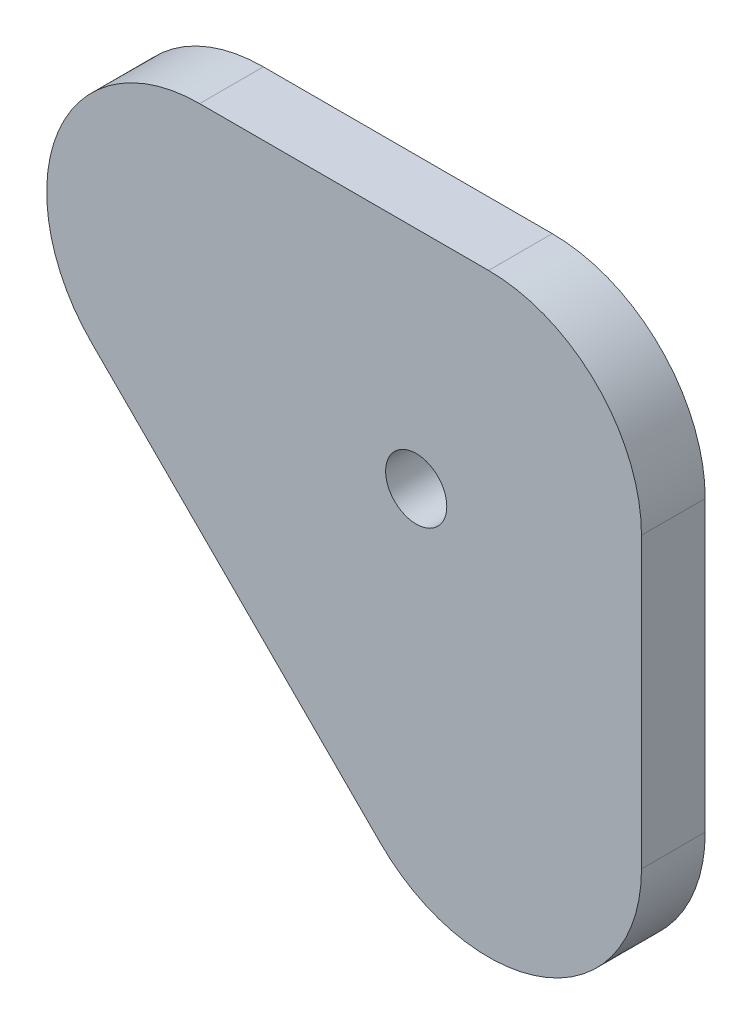
ISO-10303-21;
HEADER;
FILE_DESCRIPTION(('STEP AP214'),'2;1');
FILE_NAME('part.step','',(''),(''),'','','');
FILE_SCHEMA(('AUTOMOTIVE_DESIGN { 1 0 10303 214 1 1 1 1 }'));
ENDSEC;
DATA;
#1=APPLICATION_CONTEXT('core data for automotive mechanical design processes');
#2=APPLICATION_PROTOCOL_DEFINITION('international standard','automotive_design',2000,#1);
#3=PRODUCT_CONTEXT('',#1,'mechanical');
#4=PRODUCT('Part','Part','',(#3));
#5=PRODUCT_RELATED_PRODUCT_CATEGORY('part','',(#4));
#6=PRODUCT_DEFINITION_FORMATION('','',#4);
#7=PRODUCT_DEFINITION_CONTEXT('part definition',#1,'design');
#8=PRODUCT_DEFINITION('design','',#6,#7);
#9=PRODUCT_DEFINITION_SHAPE('','',#8);
#10=(LENGTH_UNIT() NAMED_UNIT(*) SI_UNIT(.MILLI.,.METRE.));
#11=(NAMED_UNIT(*) PLANE_ANGLE_UNIT() SI_UNIT($,.RADIAN.));
#12=(NAMED_UNIT(*) SI_UNIT($,.STERADIAN.) SOLID_ANGLE_UNIT());
#13=UNCERTAINTY_MEASURE_WITH_UNIT(LENGTH_MEASURE(1.E-05),#10,'distance_accuracy_value','');
#14=(GEOMETRIC_REPRESENTATION_CONTEXT(3) GLOBAL_UNCERTAINTY_ASSIGNED_CONTEXT((#13)) GLOBAL_UNIT_ASSIGNED_CONTEXT((#10,
#11,#12)) REPRESENTATION_CONTEXT('',''));
#15=CARTESIAN_POINT('',(0.,0.,0.));
#16=DIRECTION('',(0.,0.,1.));
#17=DIRECTION('',(1.,0.,0.));
#18=AXIS2_PLACEMENT_3D('',#15,#16,#17);
#19=CARTESIAN_POINT('',(-92.146105664654,-73.1582446553416,5.));
#20=DIRECTION('',(0.,0.,1.));
#21=DIRECTION('',(1.,0.,0.));
#22=AXIS2_PLACEMENT_3D('',#19,#20,#21);
#23=PLANE('',#22);
#24=CARTESIAN_POINT('',(-92.146105664654,-73.1582446553416,5.));
#25=DIRECTION('',(0.,0.,1.));
#26=DIRECTION('',(1.,0.,0.));
#27=AXIS2_PLACEMENT_3D('',#24,#25,#26);
#28=CIRCLE('',#27,11.9999999999999);
#29=CARTESIAN_POINT('',(-92.146105664654,-61.1582446553416,5.));
#30=VERTEX_POINT('',#29);
#31=CARTESIAN_POINT('',(-100.631387038892,-81.64352602958,5.));
#32=VERTEX_POINT('',#31);
#33=EDGE_CURVE('E128',#30,#32,#28,.T.);
#34=ORIENTED_EDGE('',*,*,#33,.T.);
#35=DIRECTION('',(0.707106781186534,-0.707106781186561,0.));
#36=VECTOR('',#35,1.);
#37=CARTESIAN_POINT('',(-100.631387038892,-81.64352602958,5.));
#38=LINE('',#37,#36);
#39=CARTESIAN_POINT('',(-77.9623394805927,-104.31257358788,5.));
#40=VERTEX_POINT('',#39);
#41=EDGE_CURVE('E86',#32,#40,#38,.T.);
#42=ORIENTED_EDGE('',*,*,#41,.T.);
#43=CARTESIAN_POINT('',(-69.477058106354,-95.8272922136416,5.));
#44=DIRECTION('',(0.,0.,1.));
#45=DIRECTION('',(1.,0.,0.));
#46=AXIS2_PLACEMENT_3D('',#43,#44,#45);
#47=CIRCLE('',#46,12.0000000000002);
#48=CARTESIAN_POINT('',(-57.477058106354,-95.8272922136416,5.));
#49=VERTEX_POINT('',#48);
#50=EDGE_CURVE('E99',#40,#49,#47,.T.);
#51=ORIENTED_EDGE('',*,*,#50,.T.);
#52=DIRECTION('',(0.,1.,0.));
#53=VECTOR('',#52,1.);
#54=CARTESIAN_POINT('',(-57.477058106354,-95.8272922136416,5.));
#55=LINE('',#54,#53);
#56=CARTESIAN_POINT('',(-57.4770581063536,-73.1582446553416,5.));
#57=VERTEX_POINT('',#56);
#58=EDGE_CURVE('E93',#49,#57,#55,.T.);
#59=ORIENTED_EDGE('',*,*,#58,.T.);
#60=CARTESIAN_POINT('',(-69.477058106354,-73.1582446553416,5.));
#61=DIRECTION('',(0.,0.,1.));
#62=DIRECTION('',(1.,0.,0.));
#63=AXIS2_PLACEMENT_3D('',#60,#61,#62);
#64=CIRCLE('',#63,12.0000000000003);
#65=CARTESIAN_POINT('',(-69.477058106354,-61.1582446553416,5.));
#66=VERTEX_POINT('',#65);
#67=EDGE_CURVE('E97',#57,#66,#64,.T.);
#68=ORIENTED_EDGE('',*,*,#67,.T.);
#69=DIRECTION('',(-1.,0.,0.));
#70=VECTOR('',#69,1.);
#71=CARTESIAN_POINT('',(-69.477058106354,-61.1582446553416,5.));
#72=LINE('',#71,#70);
#73=EDGE_CURVE('E49',#66,#30,#72,.T.);
#74=ORIENTED_EDGE('',*,*,#73,.T.);
#75=EDGE_LOOP('',(#34,#42,#51,#59,#68,#74));
#76=FACE_BOUND('',#75,.T.);
#77=CARTESIAN_POINT('',(-75.1547276360539,-78.8359141850415,5.));
#78=DIRECTION('',(0.,0.,1.));
#79=DIRECTION('',(1.,0.,0.));
#80=AXIS2_PLACEMENT_3D('',#77,#78,#79);
#81=CIRCLE('',#80,2.39999999999985);
#82=CARTESIAN_POINT('',(-72.7547276360541,-78.8359141850415,5.));
#83=VERTEX_POINT('',#82);
#84=EDGE_CURVE('E121',#83,#83,#81,.T.);
#85=ORIENTED_EDGE('',*,*,#84,.F.);
#86=EDGE_LOOP('',(#85));
#87=FACE_BOUND('',#86,.T.);
#88=ADVANCED_FACE('F32',(#76,#87),#23,.T.);
#89=CARTESIAN_POINT('',(-92.146105664654,-73.1582446553416,0.));
#90=DIRECTION('',(0.,0.,1.));
#91=DIRECTION('',(1.,0.,0.));
#92=AXIS2_PLACEMENT_3D('',#89,#90,#91);
#93=PLANE('',#92);
#94=CARTESIAN_POINT('',(-92.146105664654,-73.1582446553416,0.));
#95=DIRECTION('',(0.,0.,1.));
#96=DIRECTION('',(1.,0.,0.));
#97=AXIS2_PLACEMENT_3D('',#94,#95,#96);
#98=CIRCLE('',#97,11.9999999999999);
#99=CARTESIAN_POINT('',(-92.146105664654,-61.1582446553416,0.));
#100=VERTEX_POINT('',#99);
#101=CARTESIAN_POINT('',(-100.631387038892,-81.64352602958,0.));
#102=VERTEX_POINT('',#101);
#103=EDGE_CURVE('E117',#100,#102,#98,.T.);
#104=ORIENTED_EDGE('',*,*,#103,.F.);
#105=DIRECTION('',(-1.,0.,0.));
#106=VECTOR('',#105,1.);
#107=CARTESIAN_POINT('',(-69.477058106354,-61.1582446553416,0.));
#108=LINE('',#107,#106);
#109=CARTESIAN_POINT('',(-69.477058106354,-61.1582446553416,0.));
#110=VERTEX_POINT('',#109);
#111=EDGE_CURVE('E78',#110,#100,#108,.T.);
#112=ORIENTED_EDGE('',*,*,#111,.F.);
#113=CARTESIAN_POINT('',(-69.477058106354,-73.1582446553416,0.));
#114=DIRECTION('',(0.,0.,1.));
#115=DIRECTION('',(1.,0.,0.));
#116=AXIS2_PLACEMENT_3D('',#113,#114,#115);
#117=CIRCLE('',#116,12.0000000000003);
#118=CARTESIAN_POINT('',(-57.4770581063536,-73.1582446553416,0.));
#119=VERTEX_POINT('',#118);
#120=EDGE_CURVE('E72',#119,#110,#117,.T.);
#121=ORIENTED_EDGE('',*,*,#120,.F.);
#122=DIRECTION('',(0.,1.,0.));
#123=VECTOR('',#122,1.);
#124=CARTESIAN_POINT('',(-57.477058106354,-95.8272922136416,0.));
#125=LINE('',#124,#123);
#126=CARTESIAN_POINT('',(-57.477058106354,-95.8272922136416,0.));
#127=VERTEX_POINT('',#126);
#128=EDGE_CURVE('E107',#127,#119,#125,.T.);
#129=ORIENTED_EDGE('',*,*,#128,.F.);
#130=CARTESIAN_POINT('',(-69.477058106354,-95.8272922136416,0.));
#131=DIRECTION('',(0.,0.,1.));
#132=DIRECTION('',(1.,0.,0.));
#133=AXIS2_PLACEMENT_3D('',#130,#131,#132);
#134=CIRCLE('',#133,12.0000000000002);
#135=CARTESIAN_POINT('',(-77.9623394805927,-104.31257358788,0.));
#136=VERTEX_POINT('',#135);
#137=EDGE_CURVE('E123',#136,#127,#134,.T.);
#138=ORIENTED_EDGE('',*,*,#137,.F.);
#139=DIRECTION('',(0.707106781186534,-0.707106781186561,0.));
#140=VECTOR('',#139,1.);
#141=CARTESIAN_POINT('',(-100.631387038892,-81.64352602958,0.));
#142=LINE('',#141,#140);
#143=EDGE_CURVE('E120',#102,#136,#142,.T.);
#144=ORIENTED_EDGE('',*,*,#143,.F.);
#145=EDGE_LOOP('',(#104,#112,#121,#129,#138,#144));
#146=FACE_BOUND('',#145,.T.);
#147=CARTESIAN_POINT('',(-75.1547276360539,-78.8359141850415,0.));
#148=DIRECTION('',(0.,0.,1.));
#149=DIRECTION('',(1.,0.,0.));
#150=AXIS2_PLACEMENT_3D('',#147,#148,#149);
#151=CIRCLE('',#150,2.39999999999985);
#152=CARTESIAN_POINT('',(-72.7547276360541,-78.8359141850415,0.));
#153=VERTEX_POINT('',#152);
#154=EDGE_CURVE('E221',#153,#153,#151,.T.);
#155=ORIENTED_EDGE('',*,*,#154,.T.);
#156=EDGE_LOOP('',(#155));
#157=FACE_BOUND('',#156,.T.);
#158=ADVANCED_FACE('F137',(#146,#157),#93,.F.);
#159=CARTESIAN_POINT('',(-92.146105664654,-73.1582446553416,5.));
#160=DIRECTION('',(0.,0.,-1.));
#161=DIRECTION('',(-1.,0.,0.));
#162=AXIS2_PLACEMENT_3D('',#159,#160,#161);
#163=CYLINDRICAL_SURFACE('',#162,11.9999999999999);
#164=ORIENTED_EDGE('',*,*,#103,.T.);
#165=DIRECTION('',(0.,0.,-1.));
#166=VECTOR('',#165,1.);
#167=CARTESIAN_POINT('',(-100.631387038892,-81.64352602958,5.));
#168=LINE('',#167,#166);
#169=EDGE_CURVE('E11',#32,#102,#168,.T.);
#170=ORIENTED_EDGE('',*,*,#169,.F.);
#171=ORIENTED_EDGE('',*,*,#33,.F.);
#172=DIRECTION('',(0.,0.,-1.));
#173=VECTOR('',#172,1.);
#174=CARTESIAN_POINT('',(-92.146105664654,-61.1582446553416,5.));
#175=LINE('',#174,#173);
#176=EDGE_CURVE('E113',#30,#100,#175,.T.);
#177=ORIENTED_EDGE('',*,*,#176,.T.);
#178=EDGE_LOOP('',(#164,#170,#171,#177));
#179=FACE_BOUND('',#178,.T.);
#180=ADVANCED_FACE('F34',(#179),#163,.T.);
#181=CARTESIAN_POINT('',(-100.631387038892,-81.64352602958,5.));
#182=DIRECTION('',(0.707106781186561,0.707106781186534,0.));
#183=DIRECTION('',(-0.707106781186534,0.707106781186561,0.));
#184=AXIS2_PLACEMENT_3D('',#181,#182,#183);
#185=PLANE('',#184);
#186=ORIENTED_EDGE('',*,*,#143,.T.);
#187=DIRECTION('',(0.,0.,-1.));
#188=VECTOR('',#187,1.);
#189=CARTESIAN_POINT('',(-77.9623394805927,-104.31257358788,5.));
#190=LINE('',#189,#188);
#191=EDGE_CURVE('E41',#40,#136,#190,.T.);
#192=ORIENTED_EDGE('',*,*,#191,.F.);
#193=ORIENTED_EDGE('',*,*,#41,.F.);
#194=ORIENTED_EDGE('',*,*,#169,.T.);
#195=EDGE_LOOP('',(#186,#192,#193,#194));
#196=FACE_BOUND('',#195,.T.);
#197=ADVANCED_FACE('F162',(#196),#185,.F.);
#198=CARTESIAN_POINT('',(-69.477058106354,-95.8272922136416,5.));
#199=DIRECTION('',(0.,0.,-1.));
#200=DIRECTION('',(-1.,0.,0.));
#201=AXIS2_PLACEMENT_3D('',#198,#199,#200);
#202=CYLINDRICAL_SURFACE('',#201,12.0000000000002);
#203=ORIENTED_EDGE('',*,*,#137,.T.);
#204=DIRECTION('',(0.,0.,-1.));
#205=VECTOR('',#204,1.);
#206=CARTESIAN_POINT('',(-57.477058106354,-95.8272922136416,5.));
#207=LINE('',#206,#205);
#208=EDGE_CURVE('E108',#49,#127,#207,.T.);
#209=ORIENTED_EDGE('',*,*,#208,.F.);
#210=ORIENTED_EDGE('',*,*,#50,.F.);
#211=ORIENTED_EDGE('',*,*,#191,.T.);
#212=EDGE_LOOP('',(#203,#209,#210,#211));
#213=FACE_BOUND('',#212,.T.);
#214=ADVANCED_FACE('F134',(#213),#202,.T.);
#215=CARTESIAN_POINT('',(-57.477058106354,-95.8272922136416,5.));
#216=DIRECTION('',(-1.,0.,0.));
#217=DIRECTION('',(0.,-1.,0.));
#218=AXIS2_PLACEMENT_3D('',#215,#216,#217);
#219=PLANE('',#218);
#220=ORIENTED_EDGE('',*,*,#128,.T.);
#221=DIRECTION('',(0.,0.,-1.));
#222=VECTOR('',#221,1.);
#223=CARTESIAN_POINT('',(-57.4770581063536,-73.1582446553416,5.));
#224=LINE('',#223,#222);
#225=EDGE_CURVE('E104',#57,#119,#224,.T.);
#226=ORIENTED_EDGE('',*,*,#225,.F.);
#227=ORIENTED_EDGE('',*,*,#58,.F.);
#228=ORIENTED_EDGE('',*,*,#208,.T.);
#229=EDGE_LOOP('',(#220,#226,#227,#228));
#230=FACE_BOUND('',#229,.T.);
#231=ADVANCED_FACE('F105',(#230),#219,.F.);
#232=CARTESIAN_POINT('',(-69.477058106354,-73.1582446553416,5.));
#233=DIRECTION('',(0.,0.,-1.));
#234=DIRECTION('',(-1.,0.,0.));
#235=AXIS2_PLACEMENT_3D('',#232,#233,#234);
#236=CYLINDRICAL_SURFACE('',#235,12.0000000000003);
#237=ORIENTED_EDGE('',*,*,#120,.T.);
#238=DIRECTION('',(0.,0.,-1.));
#239=VECTOR('',#238,1.);
#240=CARTESIAN_POINT('',(-69.477058106354,-61.1582446553416,5.));
#241=LINE('',#240,#239);
#242=EDGE_CURVE('E109',#66,#110,#241,.T.);
#243=ORIENTED_EDGE('',*,*,#242,.F.);
#244=ORIENTED_EDGE('',*,*,#67,.F.);
#245=ORIENTED_EDGE('',*,*,#225,.T.);
#246=EDGE_LOOP('',(#237,#243,#244,#245));
#247=FACE_BOUND('',#246,.T.);
#248=ADVANCED_FACE('F111',(#247),#236,.T.);
#249=CARTESIAN_POINT('',(-69.477058106354,-61.1582446553416,5.));
#250=DIRECTION('',(0.,-1.,0.));
#251=DIRECTION('',(0.,0.,-1.));
#252=AXIS2_PLACEMENT_3D('',#249,#250,#251);
#253=PLANE('',#252);
#254=ORIENTED_EDGE('',*,*,#111,.T.);
#255=ORIENTED_EDGE('',*,*,#176,.F.);
#256=ORIENTED_EDGE('',*,*,#73,.F.);
#257=ORIENTED_EDGE('',*,*,#242,.T.);
#258=EDGE_LOOP('',(#254,#255,#256,#257));
#259=FACE_BOUND('',#258,.T.);
#260=ADVANCED_FACE('F142',(#259),#253,.F.);
#261=CARTESIAN_POINT('',(-75.1547276360539,-78.8359141850415,5.));
#262=DIRECTION('',(0.,0.,-1.));
#263=DIRECTION('',(-1.,0.,0.));
#264=AXIS2_PLACEMENT_3D('',#261,#262,#263);
#265=CYLINDRICAL_SURFACE('',#264,2.39999999999985);
#266=ORIENTED_EDGE('',*,*,#84,.T.);
#267=EDGE_LOOP('',(#266));
#268=FACE_BOUND('',#267,.T.);
#269=ORIENTED_EDGE('',*,*,#154,.F.);
#270=EDGE_LOOP('',(#269));
#271=FACE_BOUND('',#270,.T.);
#272=ADVANCED_FACE('F144',(#268,#271),#265,.F.);
#273=CLOSED_SHELL('',(#88,#158,#180,#197,#214,#231,#248,#260,#272));
#274=MANIFOLD_SOLID_BREP('B2',#273);
#275=ADVANCED_BREP_SHAPE_REPRESENTATION('',(#18,#274),#14);
#276=SHAPE_DEFINITION_REPRESENTATION(#9,#275);
ENDSEC;
END-ISO-10303-21;
